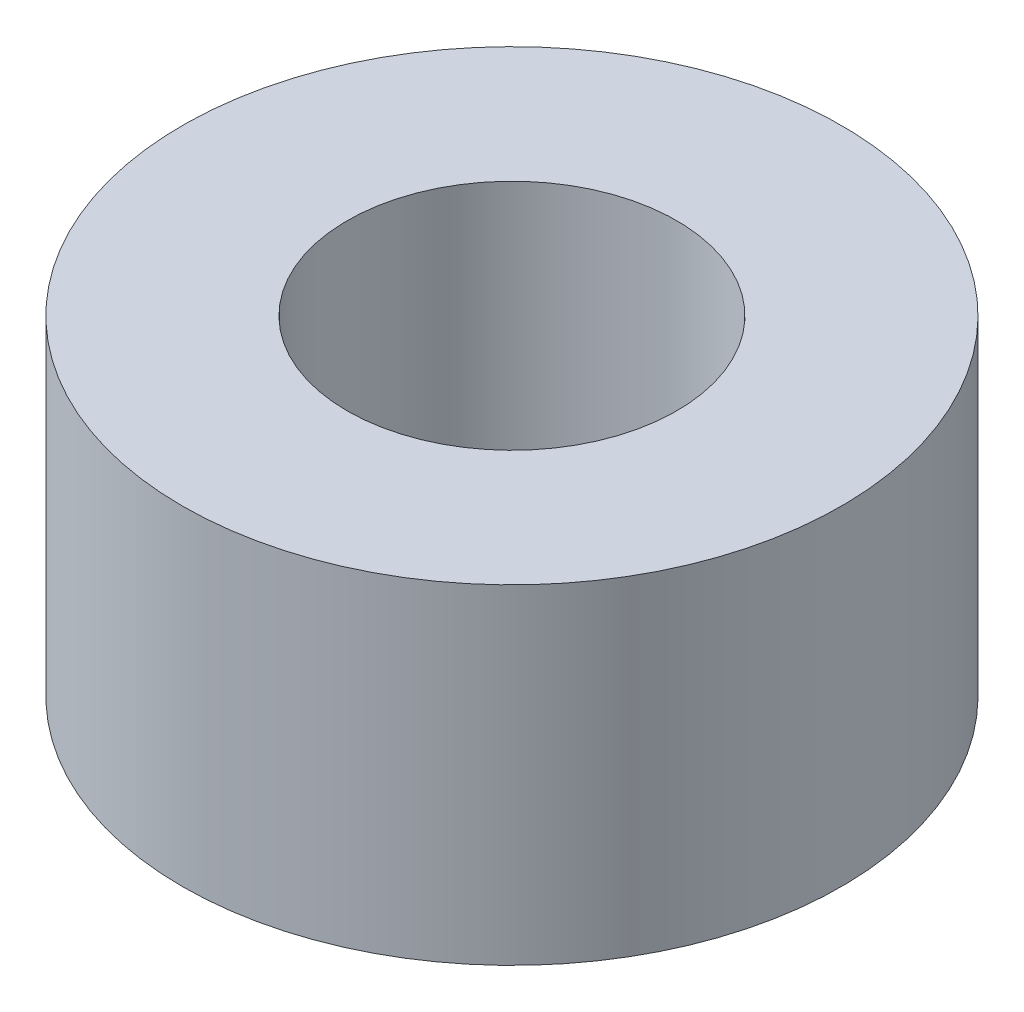
ISO-10303-21;
HEADER;
FILE_DESCRIPTION(('STEP AP214'),'2;1');
FILE_NAME('part.step','',(''),(''),'','','');
FILE_SCHEMA(('AUTOMOTIVE_DESIGN { 1 0 10303 214 1 1 1 1 }'));
ENDSEC;
DATA;
#1=APPLICATION_CONTEXT('core data for automotive mechanical design processes');
#2=APPLICATION_PROTOCOL_DEFINITION('international standard','automotive_design',2000,#1);
#3=PRODUCT_CONTEXT('',#1,'mechanical');
#4=PRODUCT('Part','Part','',(#3));
#5=PRODUCT_RELATED_PRODUCT_CATEGORY('part','',(#4));
#6=PRODUCT_DEFINITION_FORMATION('','',#4);
#7=PRODUCT_DEFINITION_CONTEXT('part definition',#1,'design');
#8=PRODUCT_DEFINITION('design','',#6,#7);
#9=PRODUCT_DEFINITION_SHAPE('','',#8);
#10=(LENGTH_UNIT() NAMED_UNIT(*) SI_UNIT(.MILLI.,.METRE.));
#11=(NAMED_UNIT(*) PLANE_ANGLE_UNIT() SI_UNIT($,.RADIAN.));
#12=(NAMED_UNIT(*) SI_UNIT($,.STERADIAN.) SOLID_ANGLE_UNIT());
#13=UNCERTAINTY_MEASURE_WITH_UNIT(LENGTH_MEASURE(1.E-05),#10,'distance_accuracy_value','');
#14=(GEOMETRIC_REPRESENTATION_CONTEXT(3) GLOBAL_UNCERTAINTY_ASSIGNED_CONTEXT((#13)) GLOBAL_UNIT_ASSIGNED_CONTEXT((#10,
#11,#12)) REPRESENTATION_CONTEXT('',''));
#15=CARTESIAN_POINT('',(0.,0.,0.));
#16=DIRECTION('',(0.,0.,1.));
#17=DIRECTION('',(1.,0.,0.));
#18=AXIS2_PLACEMENT_3D('',#15,#16,#17);
#19=CARTESIAN_POINT('',(0.,40.,0.));
#20=DIRECTION('',(0.,1.,0.));
#21=DIRECTION('',(0.,0.,1.));
#22=AXIS2_PLACEMENT_3D('',#19,#20,#21);
#23=PLANE('',#22);
#24=CARTESIAN_POINT('',(0.,40.,0.));
#25=DIRECTION('',(0.,1.,0.));
#26=DIRECTION('',(0.,0.,1.));
#27=AXIS2_PLACEMENT_3D('',#24,#25,#26);
#28=CIRCLE('',#27,40.);
#29=CARTESIAN_POINT('',(0.,40.,40.));
#30=VERTEX_POINT('',#29);
#31=EDGE_CURVE('E10',#30,#30,#28,.T.);
#32=ORIENTED_EDGE('',*,*,#31,.T.);
#33=EDGE_LOOP('',(#32));
#34=FACE_BOUND('',#33,.T.);
#35=CARTESIAN_POINT('',(0.,40.,0.));
#36=DIRECTION('',(0.,1.,0.));
#37=DIRECTION('',(0.,0.,1.));
#38=AXIS2_PLACEMENT_3D('',#35,#36,#37);
#39=CIRCLE('',#38,20.);
#40=CARTESIAN_POINT('',(0.,40.,20.));
#41=VERTEX_POINT('',#40);
#42=EDGE_CURVE('E49',#41,#41,#39,.T.);
#43=ORIENTED_EDGE('',*,*,#42,.F.);
#44=EDGE_LOOP('',(#43));
#45=FACE_BOUND('',#44,.T.);
#46=ADVANCED_FACE('F36',(#34,#45),#23,.T.);
#47=CARTESIAN_POINT('',(0.,0.,0.));
#48=DIRECTION('',(0.,1.,0.));
#49=DIRECTION('',(0.,0.,1.));
#50=AXIS2_PLACEMENT_3D('',#47,#48,#49);
#51=PLANE('',#50);
#52=CARTESIAN_POINT('',(0.,0.,0.));
#53=DIRECTION('',(0.,1.,0.));
#54=DIRECTION('',(0.,0.,1.));
#55=AXIS2_PLACEMENT_3D('',#52,#53,#54);
#56=CIRCLE('',#55,40.);
#57=CARTESIAN_POINT('',(0.,0.,40.));
#58=VERTEX_POINT('',#57);
#59=EDGE_CURVE('E40',#58,#58,#56,.T.);
#60=ORIENTED_EDGE('',*,*,#59,.F.);
#61=EDGE_LOOP('',(#60));
#62=FACE_BOUND('',#61,.T.);
#63=CARTESIAN_POINT('',(0.,0.,0.));
#64=DIRECTION('',(0.,1.,0.));
#65=DIRECTION('',(0.,0.,1.));
#66=AXIS2_PLACEMENT_3D('',#63,#64,#65);
#67=CIRCLE('',#66,20.);
#68=CARTESIAN_POINT('',(0.,0.,20.));
#69=VERTEX_POINT('',#68);
#70=EDGE_CURVE('E51',#69,#69,#67,.T.);
#71=ORIENTED_EDGE('',*,*,#70,.T.);
#72=EDGE_LOOP('',(#71));
#73=FACE_BOUND('',#72,.T.);
#74=ADVANCED_FACE('F63',(#62,#73),#51,.F.);
#75=CARTESIAN_POINT('',(0.,40.,0.));
#76=DIRECTION('',(0.,-1.,0.));
#77=DIRECTION('',(0.,0.,-1.));
#78=AXIS2_PLACEMENT_3D('',#75,#76,#77);
#79=CYLINDRICAL_SURFACE('',#78,40.);
#80=ORIENTED_EDGE('',*,*,#31,.F.);
#81=EDGE_LOOP('',(#80));
#82=FACE_BOUND('',#81,.T.);
#83=ORIENTED_EDGE('',*,*,#59,.T.);
#84=EDGE_LOOP('',(#83));
#85=FACE_BOUND('',#84,.T.);
#86=ADVANCED_FACE('F38',(#82,#85),#79,.T.);
#87=CARTESIAN_POINT('',(0.,40.,0.));
#88=DIRECTION('',(0.,-1.,0.));
#89=DIRECTION('',(0.,0.,-1.));
#90=AXIS2_PLACEMENT_3D('',#87,#88,#89);
#91=CYLINDRICAL_SURFACE('',#90,20.);
#92=ORIENTED_EDGE('',*,*,#42,.T.);
#93=EDGE_LOOP('',(#92));
#94=FACE_BOUND('',#93,.T.);
#95=ORIENTED_EDGE('',*,*,#70,.F.);
#96=EDGE_LOOP('',(#95));
#97=FACE_BOUND('',#96,.T.);
#98=ADVANCED_FACE('F59',(#94,#97),#91,.F.);
#99=CLOSED_SHELL('',(#46,#74,#86,#98));
#100=MANIFOLD_SOLID_BREP('B2',#99);
#101=ADVANCED_BREP_SHAPE_REPRESENTATION('',(#18,#100),#14);
#102=SHAPE_DEFINITION_REPRESENTATION(#9,#101);
ENDSEC;
END-ISO-10303-21;
